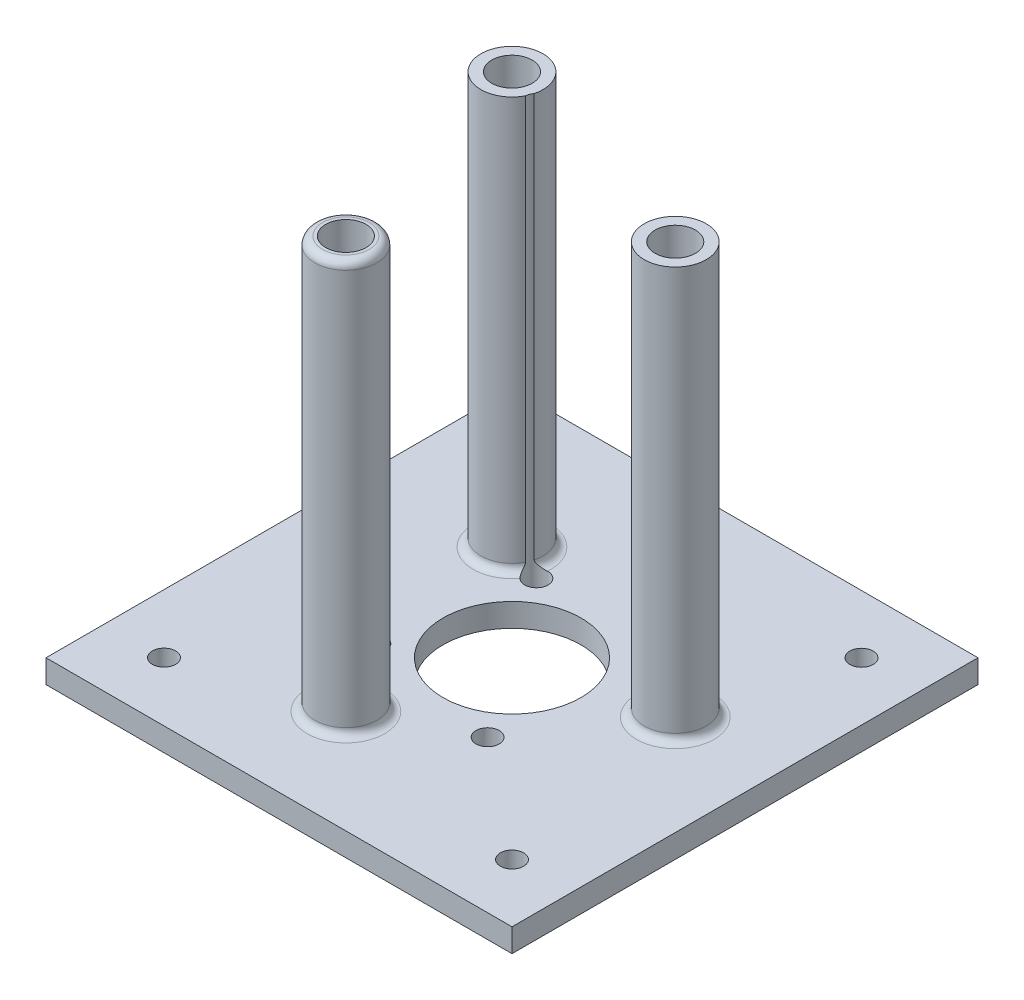
ISO-10303-21;
HEADER;
FILE_DESCRIPTION(('STEP AP214'),'2;1');
FILE_NAME('part.step','',(''),(''),'','','');
FILE_SCHEMA(('AUTOMOTIVE_DESIGN { 1 0 10303 214 1 1 1 1 }'));
ENDSEC;
DATA;
#1=APPLICATION_CONTEXT('core data for automotive mechanical design processes');
#2=APPLICATION_PROTOCOL_DEFINITION('international standard','automotive_design',2000,#1);
#3=PRODUCT_CONTEXT('',#1,'mechanical');
#4=PRODUCT('Part','Part','',(#3));
#5=PRODUCT_RELATED_PRODUCT_CATEGORY('part','',(#4));
#6=PRODUCT_DEFINITION_FORMATION('','',#4);
#7=PRODUCT_DEFINITION_CONTEXT('part definition',#1,'design');
#8=PRODUCT_DEFINITION('design','',#6,#7);
#9=PRODUCT_DEFINITION_SHAPE('','',#8);
#10=(LENGTH_UNIT() NAMED_UNIT(*) SI_UNIT(.MILLI.,.METRE.));
#11=(NAMED_UNIT(*) PLANE_ANGLE_UNIT() SI_UNIT($,.RADIAN.));
#12=(NAMED_UNIT(*) SI_UNIT($,.STERADIAN.) SOLID_ANGLE_UNIT());
#13=UNCERTAINTY_MEASURE_WITH_UNIT(LENGTH_MEASURE(1.E-05),#10,'distance_accuracy_value','');
#14=(GEOMETRIC_REPRESENTATION_CONTEXT(3) GLOBAL_UNCERTAINTY_ASSIGNED_CONTEXT((#13)) GLOBAL_UNIT_ASSIGNED_CONTEXT((#10,
#11,#12)) REPRESENTATION_CONTEXT('',''));
#15=CARTESIAN_POINT('',(0.,0.,0.));
#16=DIRECTION('',(0.,0.,1.));
#17=DIRECTION('',(1.,0.,0.));
#18=AXIS2_PLACEMENT_3D('',#15,#16,#17);
#19=CARTESIAN_POINT('',(29.9166320617212,3.,0.));
#20=DIRECTION('',(1.,0.,0.));
#21=DIRECTION('',(0.,0.,-1.));
#22=AXIS2_PLACEMENT_3D('',#19,#20,#21);
#23=PLANE('',#22);
#24=DIRECTION('',(0.,0.,1.));
#25=VECTOR('',#24,1.);
#26=CARTESIAN_POINT('',(29.9166320617212,0.,0.));
#27=LINE('',#26,#25);
#28=CARTESIAN_POINT('',(29.9166320617212,0.,-29.8888427489616));
#29=VERTEX_POINT('',#28);
#30=CARTESIAN_POINT('',(29.9166320617212,0.,30.1111572510384));
#31=VERTEX_POINT('',#30);
#32=EDGE_CURVE('E202',#29,#31,#27,.T.);
#33=ORIENTED_EDGE('',*,*,#32,.F.);
#34=DIRECTION('',(0.,-1.,0.));
#35=VECTOR('',#34,1.);
#36=CARTESIAN_POINT('',(29.9166320617212,3.,-29.8888427489616));
#37=LINE('',#36,#35);
#38=CARTESIAN_POINT('',(29.9166320617212,3.,-29.8888427489616));
#39=VERTEX_POINT('',#38);
#40=EDGE_CURVE('E226',#39,#29,#37,.T.);
#41=ORIENTED_EDGE('',*,*,#40,.F.);
#42=DIRECTION('',(0.,0.,1.));
#43=VECTOR('',#42,1.);
#44=CARTESIAN_POINT('',(29.9166320617212,3.,0.));
#45=LINE('',#44,#43);
#46=CARTESIAN_POINT('',(29.9166320617212,3.,30.1111572510384));
#47=VERTEX_POINT('',#46);
#48=EDGE_CURVE('E165',#39,#47,#45,.T.);
#49=ORIENTED_EDGE('',*,*,#48,.T.);
#50=DIRECTION('',(0.,-1.,0.));
#51=VECTOR('',#50,1.);
#52=CARTESIAN_POINT('',(29.9166320617212,3.,30.1111572510384));
#53=LINE('',#52,#51);
#54=EDGE_CURVE('E180',#47,#31,#53,.T.);
#55=ORIENTED_EDGE('',*,*,#54,.T.);
#56=EDGE_LOOP('',(#33,#41,#49,#55));
#57=FACE_BOUND('',#56,.T.);
#58=ADVANCED_FACE('F41',(#57),#23,.T.);
#59=CARTESIAN_POINT('',(0.,3.,-29.8888427489616));
#60=DIRECTION('',(0.,0.,-1.));
#61=DIRECTION('',(-1.,0.,0.));
#62=AXIS2_PLACEMENT_3D('',#59,#60,#61);
#63=PLANE('',#62);
#64=DIRECTION('',(1.,0.,0.));
#65=VECTOR('',#64,1.);
#66=CARTESIAN_POINT('',(0.,0.,-29.8888427489616));
#67=LINE('',#66,#65);
#68=CARTESIAN_POINT('',(-30.0833679382788,0.,-29.8888427489616));
#69=VERTEX_POINT('',#68);
#70=EDGE_CURVE('E206',#69,#29,#67,.T.);
#71=ORIENTED_EDGE('',*,*,#70,.F.);
#72=DIRECTION('',(0.,-1.,0.));
#73=VECTOR('',#72,1.);
#74=CARTESIAN_POINT('',(-30.0833679382788,3.,-29.8888427489616));
#75=LINE('',#74,#73);
#76=CARTESIAN_POINT('',(-30.0833679382788,3.,-29.8888427489616));
#77=VERTEX_POINT('',#76);
#78=EDGE_CURVE('E223',#77,#69,#75,.T.);
#79=ORIENTED_EDGE('',*,*,#78,.F.);
#80=DIRECTION('',(1.,0.,0.));
#81=VECTOR('',#80,1.);
#82=CARTESIAN_POINT('',(0.,3.,-29.8888427489616));
#83=LINE('',#82,#81);
#84=EDGE_CURVE('E169',#77,#39,#83,.T.);
#85=ORIENTED_EDGE('',*,*,#84,.T.);
#86=ORIENTED_EDGE('',*,*,#40,.T.);
#87=EDGE_LOOP('',(#71,#79,#85,#86));
#88=FACE_BOUND('',#87,.T.);
#89=ADVANCED_FACE('F303',(#88),#63,.T.);
#90=CARTESIAN_POINT('',(-30.0833679382788,3.,0.));
#91=DIRECTION('',(1.,0.,0.));
#92=DIRECTION('',(0.,0.,-1.));
#93=AXIS2_PLACEMENT_3D('',#90,#91,#92);
#94=PLANE('',#93);
#95=DIRECTION('',(0.,0.,1.));
#96=VECTOR('',#95,1.);
#97=CARTESIAN_POINT('',(-30.0833679382788,0.,0.));
#98=LINE('',#97,#96);
#99=CARTESIAN_POINT('',(-30.0833679382788,0.,30.1111572510384));
#100=VERTEX_POINT('',#99);
#101=EDGE_CURVE('E210',#69,#100,#98,.T.);
#102=ORIENTED_EDGE('',*,*,#101,.T.);
#103=DIRECTION('',(0.,-1.,0.));
#104=VECTOR('',#103,1.);
#105=CARTESIAN_POINT('',(-30.0833679382788,3.,30.1111572510384));
#106=LINE('',#105,#104);
#107=CARTESIAN_POINT('',(-30.0833679382788,3.,30.1111572510384));
#108=VERTEX_POINT('',#107);
#109=EDGE_CURVE('E219',#108,#100,#106,.T.);
#110=ORIENTED_EDGE('',*,*,#109,.F.);
#111=DIRECTION('',(0.,0.,1.));
#112=VECTOR('',#111,1.);
#113=CARTESIAN_POINT('',(-30.0833679382788,3.,0.));
#114=LINE('',#113,#112);
#115=EDGE_CURVE('E173',#77,#108,#114,.T.);
#116=ORIENTED_EDGE('',*,*,#115,.F.);
#117=ORIENTED_EDGE('',*,*,#78,.T.);
#118=EDGE_LOOP('',(#102,#110,#116,#117));
#119=FACE_BOUND('',#118,.T.);
#120=ADVANCED_FACE('F278',(#119),#94,.F.);
#121=CARTESIAN_POINT('',(-7.37576634527576,3.,-10.3205696181635));
#122=DIRECTION('',(0.,-1.,0.));
#123=DIRECTION('',(0.,0.,-1.));
#124=AXIS2_PLACEMENT_3D('',#121,#122,#123);
#125=CYLINDRICAL_SURFACE('',#124,1.5);
#126=DIRECTION('',(0.,-1.,0.));
#127=VECTOR('',#126,1.);
#128=CARTESIAN_POINT('',(-8.87187084224171,56.,-10.428603567264));
#129=LINE('',#128,#127);
#130=CARTESIAN_POINT('',(-8.87187084224171,56.,-10.428603567264));
#131=VERTEX_POINT('',#130);
#132=CARTESIAN_POINT('',(-8.87187084224171,4.,-10.428603567264));
#133=VERTEX_POINT('',#132);
#134=EDGE_CURVE('E108',#131,#133,#129,.T.);
#135=ORIENTED_EDGE('',*,*,#134,.T.);
#136=CARTESIAN_POINT('',(-8.87187084224171,4.,-10.428603567264));
#137=CARTESIAN_POINT('',(-8.87184067217819,3.97176934304285,-10.4287382705425));
#138=CARTESIAN_POINT('',(-8.87209722711787,3.94381525377746,-10.4255187396239));
#139=CARTESIAN_POINT('',(-8.87287371271332,3.88955773884842,-10.4139305742851));
#140=CARTESIAN_POINT('',(-8.8733881224425,3.86323219674153,-10.405669117642));
#141=CARTESIAN_POINT('',(-8.87466015286941,3.79857566096496,-10.380080502114));
#142=CARTESIAN_POINT('',(-8.87540208961787,3.76128125837833,-10.3602690749949));
#143=CARTESIAN_POINT('',(-8.87592922737615,3.68935514958082,-10.3156335737701));
#144=CARTESIAN_POINT('',(-8.87570218561712,3.65476317331085,-10.2907491612967));
#145=CARTESIAN_POINT('',(-8.87372346696246,3.58804262537501,-10.2379721592256));
#146=CARTESIAN_POINT('',(-8.87197228573329,3.55591325653861,-10.2100805501838));
#147=CARTESIAN_POINT('',(-8.8665726311351,3.49375395098718,-10.1522075305655));
#148=CARTESIAN_POINT('',(-8.86292254857545,3.46372581945303,-10.1222243662272));
#149=CARTESIAN_POINT('',(-8.84868848564273,3.37683099733819,-10.0301610933151));
#150=CARTESIAN_POINT('',(-8.83481780225356,3.32286958462097,-9.96572904034051));
#151=CARTESIAN_POINT('',(-8.80032181998036,3.23496321259527,-9.84774452288231));
#152=CARTESIAN_POINT('',(-8.7818384569456,3.19922196855153,-9.79489617313397));
#153=CARTESIAN_POINT('',(-8.73713196504163,3.13483560173249,-9.68810297655839));
#154=CARTESIAN_POINT('',(-8.71091950728153,3.10618079476582,-9.63415973637244));
#155=CARTESIAN_POINT('',(-8.65660330703867,3.06311211694501,-9.53838619432496));
#156=CARTESIAN_POINT('',(-8.63010028084505,3.04696363514807,-9.49643039153087));
#157=CARTESIAN_POINT('',(-8.57194796754169,3.02137981090074,-9.41410964658085));
#158=CARTESIAN_POINT('',(-8.54031159640014,3.01192793145482,-9.37374101969361));
#159=CARTESIAN_POINT('',(-8.49403031145033,3.00419054922414,-9.32064712519376));
#160=CARTESIAN_POINT('',(-8.48133729871753,3.00262508948983,-9.30663058293478));
#161=CARTESIAN_POINT('',(-8.45539310537056,3.00053013999067,-9.27904983521629));
#162=CARTESIAN_POINT('',(-8.44214204719819,3.00000042416862,-9.26548553168842));
#163=CARTESIAN_POINT('',(-8.42863134705702,2.99999999999998,-9.25217114941493));
#164=B_SPLINE_CURVE_WITH_KNOTS('',3,(#136,#137,#138,#139,#140,#141,#142,#143,#144,#145,#146,
#147,#148,#149,#150,#151,#152,#153,#154,#155,#156,#157,#158,#159,#160,#161,#162,#163),
.UNSPECIFIED.,.F.,.F.,(4,2,2,2,2,2,2,2,2,2,2,2,2,4),(0.,0.0840740136254723,0.166420241253782,
0.292433966498774,0.420044521351919,0.547613591388197,0.6752909441201,0.9295443319198,
1.12816730349108,1.32651732180563,1.48248772239801,1.63807160492424,1.69496112892353,
1.75183823506335),.UNSPECIFIED.);
#165=CARTESIAN_POINT('',(-8.42863134705701,3.,-9.25217114941494));
#166=VERTEX_POINT('',#165);
#167=EDGE_CURVE('E63',#133,#166,#164,.T.);
#168=ORIENTED_EDGE('',*,*,#167,.T.);
#169=CARTESIAN_POINT('',(-7.37576634527576,3.,-10.3205696181635));
#170=DIRECTION('',(0.,1.,0.));
#171=DIRECTION('',(0.,0.,1.));
#172=AXIS2_PLACEMENT_3D('',#169,#170,#171);
#173=CIRCLE('',#172,1.5);
#174=CARTESIAN_POINT('',(-7.45689944827082,3.,-11.8183738175161));
#175=VERTEX_POINT('',#174);
#176=EDGE_CURVE('E162',#166,#175,#173,.T.);
#177=ORIENTED_EDGE('',*,*,#176,.T.);
#178=CARTESIAN_POINT('',(-7.45689944827082,3.,-11.8183738175161));
#179=CARTESIAN_POINT('',(-7.48384267313955,2.9999968455293,-11.816918278987));
#180=CARTESIAN_POINT('',(-7.51072680475569,3.00107197957294,-11.814728381199));
#181=CARTESIAN_POINT('',(-7.56415173228456,3.00528844687066,-11.8089345295639));
#182=CARTESIAN_POINT('',(-7.5906928541858,3.0084276445182,-11.8053320388253));
#183=CARTESIAN_POINT('',(-7.66902150536573,3.02072680534029,-11.7925664832664));
#184=CARTESIAN_POINT('',(-7.72006144681991,3.03277223836893,-11.7814138304384));
#185=CARTESIAN_POINT('',(-7.81855619813955,3.06346124666043,-11.7546342539507));
#186=CARTESIAN_POINT('',(-7.8660240353592,3.08207928006594,-11.7390246946));
#187=CARTESIAN_POINT('',(-7.95710293061214,3.12483150161788,-11.7042005060119));
#188=CARTESIAN_POINT('',(-8.00070270641135,3.14898113482462,-11.6849758101974));
#189=CARTESIAN_POINT('',(-8.10515293332082,3.21542771403153,-11.6331727053424));
#190=CARTESIAN_POINT('',(-8.16328033516901,3.26065485148852,-11.5988261432032));
#191=CARTESIAN_POINT('',(-8.24313890544823,3.33438051607456,-11.5447857322293));
#192=CARTESIAN_POINT('',(-8.26856374758056,3.35997255613191,-11.5263272999429));
#193=CARTESIAN_POINT('',(-8.31699369213383,3.41301396839425,-11.4889124445025));
#194=CARTESIAN_POINT('',(-8.33999973556556,3.44046261142456,-11.4699562186244));
#195=CARTESIAN_POINT('',(-8.39166093874478,3.50773970793561,-11.4248929642958));
#196=CARTESIAN_POINT('',(-8.41923365751764,3.54837482681568,-11.3987492235463));
#197=CARTESIAN_POINT('',(-8.46931533555652,3.63355154984613,-11.3478974050148));
#198=CARTESIAN_POINT('',(-8.49183102298434,3.67808785259133,-11.3231874525136));
#199=CARTESIAN_POINT('',(-8.52123096416486,3.75057766952534,-11.2891586643268));
#200=CARTESIAN_POINT('',(-8.53052722660629,3.77666805508895,-11.2780088936601));
#201=CARTESIAN_POINT('',(-8.54650642894278,3.83048901245797,-11.2583995292904));
#202=CARTESIAN_POINT('',(-8.55320575983573,3.85820798158835,-11.2499231276507));
#203=CARTESIAN_POINT('',(-8.56140113037024,3.90502214894231,-11.2394276007067));
#204=CARTESIAN_POINT('',(-8.5639011325788,3.92365762535766,-11.2361833340086));
#205=CARTESIAN_POINT('',(-8.56731441218648,3.96150748278233,-11.2317315916445));
#206=CARTESIAN_POINT('',(-8.56821056702264,3.98072590880373,-11.2305460992271));
#207=CARTESIAN_POINT('',(-8.56818752840913,4.,-11.230587047675));
#208=B_SPLINE_CURVE_WITH_KNOTS('',3,(#178,#179,#180,#181,#182,#183,#184,#185,#186,#187,#188,
#189,#190,#191,#192,#193,#194,#195,#196,#197,#198,#199,#200,#201,#202,#203,#204,#205,#206,#207),
.UNSPECIFIED.,.F.,.F.,(4,2,2,2,2,2,2,2,2,2,2,2,2,2,4),(0.,0.0808815755149433,0.161679597410632,
0.32165658316092,0.481018602763171,0.640831129513227,0.883197250791613,1.00468702296784,
1.12612935442732,1.29275081635536,1.45914926485655,1.54854738033475,1.63737168086891,
1.69444079881121,1.75211562829355),.UNSPECIFIED.);
#209=CARTESIAN_POINT('',(-8.56818752840913,4.,-11.230587047675));
#210=VERTEX_POINT('',#209);
#211=EDGE_CURVE('E121',#175,#210,#208,.T.);
#212=ORIENTED_EDGE('',*,*,#211,.T.);
#213=DIRECTION('',(0.,-1.,0.));
#214=VECTOR('',#213,1.);
#215=CARTESIAN_POINT('',(-8.56818752840913,56.,-11.230587047675));
#216=LINE('',#215,#214);
#217=CARTESIAN_POINT('',(-8.56818752840913,56.,-11.230587047675));
#218=VERTEX_POINT('',#217);
#219=EDGE_CURVE('E106',#218,#210,#216,.T.);
#220=ORIENTED_EDGE('',*,*,#219,.F.);
#221=CARTESIAN_POINT('',(-7.37576634527576,56.,-10.3205696181635));
#222=DIRECTION('',(0.,1.,0.));
#223=DIRECTION('',(0.,0.,1.));
#224=AXIS2_PLACEMENT_3D('',#221,#222,#223);
#225=CIRCLE('',#224,1.5);
#226=EDGE_CURVE('E112',#131,#218,#225,.F.);
#227=ORIENTED_EDGE('',*,*,#226,.F.);
#228=EDGE_LOOP('',(#135,#168,#177,#212,#220,#227));
#229=FACE_BOUND('',#228,.T.);
#230=CARTESIAN_POINT('',(-7.37576634527576,0.,-10.3205696181635));
#231=DIRECTION('',(0.,1.,0.));
#232=DIRECTION('',(0.,0.,1.));
#233=AXIS2_PLACEMENT_3D('',#230,#231,#232);
#234=CIRCLE('',#233,1.5);
#235=CARTESIAN_POINT('',(-7.37576634527576,0.,-8.82056961816346));
#236=VERTEX_POINT('',#235);
#237=EDGE_CURVE('E198',#236,#236,#234,.T.);
#238=ORIENTED_EDGE('',*,*,#237,.F.);
#239=EDGE_LOOP('',(#238));
#240=FACE_BOUND('',#239,.T.);
#241=ADVANCED_FACE('F118',(#229,#240),#125,.F.);
#242=CARTESIAN_POINT('',(-10.5150948074807,3.,7.40355565803537));
#243=DIRECTION('',(0.,-1.,0.));
#244=DIRECTION('',(0.,0.,-1.));
#245=AXIS2_PLACEMENT_3D('',#242,#243,#244);
#246=CYLINDRICAL_SURFACE('',#245,1.5);
#247=CARTESIAN_POINT('',(-10.5150948074807,3.,7.40355565803537));
#248=DIRECTION('',(0.,1.,0.));
#249=DIRECTION('',(0.,0.,1.));
#250=AXIS2_PLACEMENT_3D('',#247,#248,#249);
#251=CIRCLE('',#250,1.5);
#252=CARTESIAN_POINT('',(-10.5150948074807,3.,8.90355565803537));
#253=VERTEX_POINT('',#252);
#254=EDGE_CURVE('E158',#253,#253,#251,.T.);
#255=ORIENTED_EDGE('',*,*,#254,.T.);
#256=EDGE_LOOP('',(#255));
#257=FACE_BOUND('',#256,.T.);
#258=CARTESIAN_POINT('',(-10.5150948074807,0.,7.40355565803537));
#259=DIRECTION('',(0.,1.,0.));
#260=DIRECTION('',(0.,0.,1.));
#261=AXIS2_PLACEMENT_3D('',#258,#259,#260);
#262=CIRCLE('',#261,1.5);
#263=CARTESIAN_POINT('',(-10.5150948074807,0.,8.90355565803537));
#264=VERTEX_POINT('',#263);
#265=EDGE_CURVE('E194',#264,#264,#262,.T.);
#266=ORIENTED_EDGE('',*,*,#265,.F.);
#267=EDGE_LOOP('',(#266));
#268=FACE_BOUND('',#267,.T.);
#269=ADVANCED_FACE('F277',(#257,#268),#246,.F.);
#270=CARTESIAN_POINT('',(-0.083367938278827,3.,0.111157251038434));
#271=DIRECTION('',(0.,-1.,0.));
#272=DIRECTION('',(0.,0.,-1.));
#273=AXIS2_PLACEMENT_3D('',#270,#271,#272);
#274=CYLINDRICAL_SURFACE('',#273,8.88410834181085);
#275=CARTESIAN_POINT('',(-0.083367938278827,3.,0.111157251038434));
#276=DIRECTION('',(0.,1.,0.));
#277=DIRECTION('',(0.,0.,1.));
#278=AXIS2_PLACEMENT_3D('',#275,#276,#277);
#279=CIRCLE('',#278,8.88410834181085);
#280=CARTESIAN_POINT('',(-0.083367938278827,3.,8.99526559284929));
#281=VERTEX_POINT('',#280);
#282=EDGE_CURVE('E154',#281,#281,#279,.T.);
#283=ORIENTED_EDGE('',*,*,#282,.T.);
#284=EDGE_LOOP('',(#283));
#285=FACE_BOUND('',#284,.T.);
#286=CARTESIAN_POINT('',(-0.083367938278827,0.,0.111157251038434));
#287=DIRECTION('',(0.,1.,0.));
#288=DIRECTION('',(0.,0.,1.));
#289=AXIS2_PLACEMENT_3D('',#286,#287,#288);
#290=CIRCLE('',#289,8.88410834181085);
#291=CARTESIAN_POINT('',(-0.083367938278827,0.,8.99526559284929));
#292=VERTEX_POINT('',#291);
#293=EDGE_CURVE('E190',#292,#292,#290,.T.);
#294=ORIENTED_EDGE('',*,*,#293,.F.);
#295=EDGE_LOOP('',(#294));
#296=FACE_BOUND('',#295,.T.);
#297=ADVANCED_FACE('F283',(#285,#296),#274,.F.);
#298=CARTESIAN_POINT('',(7.20903046871812,3.,10.5428841202403));
#299=DIRECTION('',(0.,-1.,0.));
#300=DIRECTION('',(0.,0.,-1.));
#301=AXIS2_PLACEMENT_3D('',#298,#299,#300);
#302=CYLINDRICAL_SURFACE('',#301,1.5);
#303=CARTESIAN_POINT('',(7.20903046871812,3.,10.5428841202403));
#304=DIRECTION('',(0.,1.,0.));
#305=DIRECTION('',(0.,0.,1.));
#306=AXIS2_PLACEMENT_3D('',#303,#304,#305);
#307=CIRCLE('',#306,1.5);
#308=CARTESIAN_POINT('',(7.20903046871812,3.,12.0428841202403));
#309=VERTEX_POINT('',#308);
#310=EDGE_CURVE('E149',#309,#309,#307,.T.);
#311=ORIENTED_EDGE('',*,*,#310,.T.);
#312=EDGE_LOOP('',(#311));
#313=FACE_BOUND('',#312,.T.);
#314=CARTESIAN_POINT('',(7.20903046871812,0.,10.5428841202403));
#315=DIRECTION('',(0.,1.,0.));
#316=DIRECTION('',(0.,0.,1.));
#317=AXIS2_PLACEMENT_3D('',#314,#315,#316);
#318=CIRCLE('',#317,1.5);
#319=CARTESIAN_POINT('',(7.20903046871812,0.,12.0428841202403));
#320=VERTEX_POINT('',#319);
#321=EDGE_CURVE('E185',#320,#320,#318,.T.);
#322=ORIENTED_EDGE('',*,*,#321,.F.);
#323=EDGE_LOOP('',(#322));
#324=FACE_BOUND('',#323,.T.);
#325=ADVANCED_FACE('F287',(#313,#324),#302,.F.);
#326=CARTESIAN_POINT('',(10.3483589309231,3.,-7.18124115595851));
#327=DIRECTION('',(0.,-1.,0.));
#328=DIRECTION('',(0.,0.,-1.));
#329=AXIS2_PLACEMENT_3D('',#326,#327,#328);
#330=CYLINDRICAL_SURFACE('',#329,1.5);
#331=CARTESIAN_POINT('',(10.3483589309231,3.,-7.18124115595851));
#332=DIRECTION('',(0.,1.,0.));
#333=DIRECTION('',(0.,0.,1.));
#334=AXIS2_PLACEMENT_3D('',#331,#332,#333);
#335=CIRCLE('',#334,1.5);
#336=CARTESIAN_POINT('',(10.3483589309231,3.,-5.68124115595851));
#337=VERTEX_POINT('',#336);
#338=EDGE_CURVE('E145',#337,#337,#335,.T.);
#339=ORIENTED_EDGE('',*,*,#338,.T.);
#340=EDGE_LOOP('',(#339));
#341=FACE_BOUND('',#340,.T.);
#342=CARTESIAN_POINT('',(10.3483589309231,0.,-7.18124115595851));
#343=DIRECTION('',(0.,1.,0.));
#344=DIRECTION('',(0.,0.,1.));
#345=AXIS2_PLACEMENT_3D('',#342,#343,#344);
#346=CIRCLE('',#345,1.5);
#347=CARTESIAN_POINT('',(10.3483589309231,0.,-5.68124115595851));
#348=VERTEX_POINT('',#347);
#349=EDGE_CURVE('E181',#348,#348,#346,.T.);
#350=ORIENTED_EDGE('',*,*,#349,.F.);
#351=EDGE_LOOP('',(#350));
#352=FACE_BOUND('',#351,.T.);
#353=ADVANCED_FACE('F290',(#341,#352),#330,.F.);
#354=CARTESIAN_POINT('',(0.,3.,30.1111572510384));
#355=DIRECTION('',(0.,0.,-1.));
#356=DIRECTION('',(-1.,0.,0.));
#357=AXIS2_PLACEMENT_3D('',#354,#355,#356);
#358=PLANE('',#357);
#359=DIRECTION('',(1.,0.,0.));
#360=VECTOR('',#359,1.);
#361=CARTESIAN_POINT('',(0.,0.,30.1111572510384));
#362=LINE('',#361,#360);
#363=EDGE_CURVE('E150',#100,#31,#362,.T.);
#364=ORIENTED_EDGE('',*,*,#363,.T.);
#365=ORIENTED_EDGE('',*,*,#54,.F.);
#366=DIRECTION('',(1.,0.,0.));
#367=VECTOR('',#366,1.);
#368=CARTESIAN_POINT('',(0.,3.,30.1111572510384));
#369=LINE('',#368,#367);
#370=EDGE_CURVE('E177',#108,#47,#369,.T.);
#371=ORIENTED_EDGE('',*,*,#370,.F.);
#372=ORIENTED_EDGE('',*,*,#109,.T.);
#373=EDGE_LOOP('',(#364,#365,#371,#372));
#374=FACE_BOUND('',#373,.T.);
#375=ADVANCED_FACE('F293',(#374),#358,.F.);
#376=CARTESIAN_POINT('',(0.,3.,0.));
#377=DIRECTION('',(0.,1.,0.));
#378=DIRECTION('',(0.,0.,1.));
#379=AXIS2_PLACEMENT_3D('',#376,#377,#378);
#380=PLANE('',#379);
#381=CARTESIAN_POINT('',(-4.80677738298205,3.,16.7749036119571));
#382=DIRECTION('',(0.,1.,0.));
#383=DIRECTION('',(0.,0.,1.));
#384=AXIS2_PLACEMENT_3D('',#381,#382,#383);
#385=CIRCLE('',#384,5.);
#386=CARTESIAN_POINT('',(-4.80677738298205,3.,21.7749036119571));
#387=VERTEX_POINT('',#386);
#388=EDGE_CURVE('E475',#387,#387,#385,.F.);
#389=ORIENTED_EDGE('',*,*,#388,.T.);
#390=EDGE_LOOP('',(#389));
#391=FACE_BOUND('',#390,.T.);
#392=CARTESIAN_POINT('',(17.0328170930816,3.,-3.79284087111856));
#393=DIRECTION('',(0.,1.,0.));
#394=DIRECTION('',(0.,0.,1.));
#395=AXIS2_PLACEMENT_3D('',#392,#393,#394);
#396=CIRCLE('',#395,5.);
#397=CARTESIAN_POINT('',(17.0328170930816,3.,1.20715912888144));
#398=VERTEX_POINT('',#397);
#399=EDGE_CURVE('E471',#398,#398,#396,.F.);
#400=ORIENTED_EDGE('',*,*,#399,.T.);
#401=EDGE_LOOP('',(#400));
#402=FACE_BOUND('',#401,.T.);
#403=ORIENTED_EDGE('',*,*,#176,.F.);
#404=CARTESIAN_POINT('',(-12.4392647098964,3.,-12.2379407367877));
#405=DIRECTION('',(0.,1.,0.));
#406=DIRECTION('',(0.,0.,1.));
#407=AXIS2_PLACEMENT_3D('',#404,#405,#406);
#408=CIRCLE('',#407,5.);
#409=EDGE_CURVE('E56',#166,#175,#408,.F.);
#410=ORIENTED_EDGE('',*,*,#409,.T.);
#411=EDGE_LOOP('',(#403,#410));
#412=FACE_BOUND('',#411,.T.);
#413=CARTESIAN_POINT('',(-22.5,3.,22.5));
#414=DIRECTION('',(0.,1.,0.));
#415=DIRECTION('',(0.,0.,1.));
#416=AXIS2_PLACEMENT_3D('',#413,#414,#415);
#417=CIRCLE('',#416,1.5);
#418=CARTESIAN_POINT('',(-22.5,3.,24.));
#419=VERTEX_POINT('',#418);
#420=EDGE_CURVE('E123',#419,#419,#417,.T.);
#421=ORIENTED_EDGE('',*,*,#420,.F.);
#422=EDGE_LOOP('',(#421));
#423=FACE_BOUND('',#422,.T.);
#424=CARTESIAN_POINT('',(22.4166320617212,3.,22.6111572510384));
#425=DIRECTION('',(0.,1.,0.));
#426=DIRECTION('',(0.,0.,1.));
#427=AXIS2_PLACEMENT_3D('',#424,#425,#426);
#428=CIRCLE('',#427,1.5);
#429=CARTESIAN_POINT('',(22.4166320617212,3.,24.1111572510384));
#430=VERTEX_POINT('',#429);
#431=EDGE_CURVE('E128',#430,#430,#428,.T.);
#432=ORIENTED_EDGE('',*,*,#431,.F.);
#433=EDGE_LOOP('',(#432));
#434=FACE_BOUND('',#433,.T.);
#435=CARTESIAN_POINT('',(22.4166320617212,3.,-22.3888427489616));
#436=DIRECTION('',(0.,1.,0.));
#437=DIRECTION('',(0.,0.,1.));
#438=AXIS2_PLACEMENT_3D('',#435,#436,#437);
#439=CIRCLE('',#438,1.5);
#440=CARTESIAN_POINT('',(22.4166320617212,3.,-20.8888427489616));
#441=VERTEX_POINT('',#440);
#442=EDGE_CURVE('E133',#441,#441,#439,.T.);
#443=ORIENTED_EDGE('',*,*,#442,.F.);
#444=EDGE_LOOP('',(#443));
#445=FACE_BOUND('',#444,.T.);
#446=CARTESIAN_POINT('',(-22.5833679382788,3.,-22.3888427489616));
#447=DIRECTION('',(0.,1.,0.));
#448=DIRECTION('',(0.,0.,1.));
#449=AXIS2_PLACEMENT_3D('',#446,#447,#448);
#450=CIRCLE('',#449,1.5);
#451=CARTESIAN_POINT('',(-22.5833679382788,3.,-20.8888427489616));
#452=VERTEX_POINT('',#451);
#453=EDGE_CURVE('E137',#452,#452,#450,.T.);
#454=ORIENTED_EDGE('',*,*,#453,.F.);
#455=EDGE_LOOP('',(#454));
#456=FACE_BOUND('',#455,.T.);
#457=ORIENTED_EDGE('',*,*,#338,.F.);
#458=EDGE_LOOP('',(#457));
#459=FACE_BOUND('',#458,.T.);
#460=ORIENTED_EDGE('',*,*,#310,.F.);
#461=EDGE_LOOP('',(#460));
#462=FACE_BOUND('',#461,.T.);
#463=ORIENTED_EDGE('',*,*,#282,.F.);
#464=EDGE_LOOP('',(#463));
#465=FACE_BOUND('',#464,.T.);
#466=ORIENTED_EDGE('',*,*,#254,.F.);
#467=EDGE_LOOP('',(#466));
#468=FACE_BOUND('',#467,.T.);
#469=ORIENTED_EDGE('',*,*,#48,.F.);
#470=ORIENTED_EDGE('',*,*,#84,.F.);
#471=ORIENTED_EDGE('',*,*,#115,.T.);
#472=ORIENTED_EDGE('',*,*,#370,.T.);
#473=EDGE_LOOP('',(#469,#470,#471,#472));
#474=FACE_BOUND('',#473,.T.);
#475=ADVANCED_FACE('F298',(#391,#402,#412,#423,#434,#445,#456,#459,#462,#465,#468,#474),#380,.T.);
#476=CARTESIAN_POINT('',(0.,0.,0.));
#477=DIRECTION('',(0.,1.,0.));
#478=DIRECTION('',(0.,0.,1.));
#479=AXIS2_PLACEMENT_3D('',#476,#477,#478);
#480=PLANE('',#479);
#481=CARTESIAN_POINT('',(-22.5,0.,22.5));
#482=DIRECTION('',(0.,1.,0.));
#483=DIRECTION('',(0.,0.,1.));
#484=AXIS2_PLACEMENT_3D('',#481,#482,#483);
#485=CIRCLE('',#484,1.5);
#486=CARTESIAN_POINT('',(-22.5,0.,24.));
#487=VERTEX_POINT('',#486);
#488=EDGE_CURVE('E186',#487,#487,#485,.T.);
#489=ORIENTED_EDGE('',*,*,#488,.T.);
#490=EDGE_LOOP('',(#489));
#491=FACE_BOUND('',#490,.T.);
#492=CARTESIAN_POINT('',(22.4166320617212,0.,22.6111572510384));
#493=DIRECTION('',(0.,1.,0.));
#494=DIRECTION('',(0.,0.,1.));
#495=AXIS2_PLACEMENT_3D('',#492,#493,#494);
#496=CIRCLE('',#495,1.5);
#497=CARTESIAN_POINT('',(22.4166320617212,0.,24.1111572510384));
#498=VERTEX_POINT('',#497);
#499=EDGE_CURVE('E237',#498,#498,#496,.T.);
#500=ORIENTED_EDGE('',*,*,#499,.T.);
#501=EDGE_LOOP('',(#500));
#502=FACE_BOUND('',#501,.T.);
#503=CARTESIAN_POINT('',(22.4166320617212,0.,-22.3888427489616));
#504=DIRECTION('',(0.,1.,0.));
#505=DIRECTION('',(0.,0.,1.));
#506=AXIS2_PLACEMENT_3D('',#503,#504,#505);
#507=CIRCLE('',#506,1.5);
#508=CARTESIAN_POINT('',(22.4166320617212,0.,-20.8888427489616));
#509=VERTEX_POINT('',#508);
#510=EDGE_CURVE('E233',#509,#509,#507,.T.);
#511=ORIENTED_EDGE('',*,*,#510,.T.);
#512=EDGE_LOOP('',(#511));
#513=FACE_BOUND('',#512,.T.);
#514=CARTESIAN_POINT('',(-22.5833679382788,0.,-22.3888427489616));
#515=DIRECTION('',(0.,1.,0.));
#516=DIRECTION('',(0.,0.,1.));
#517=AXIS2_PLACEMENT_3D('',#514,#515,#516);
#518=CIRCLE('',#517,1.5);
#519=CARTESIAN_POINT('',(-22.5833679382788,0.,-20.8888427489616));
#520=VERTEX_POINT('',#519);
#521=EDGE_CURVE('E144',#520,#520,#518,.T.);
#522=ORIENTED_EDGE('',*,*,#521,.T.);
#523=EDGE_LOOP('',(#522));
#524=FACE_BOUND('',#523,.T.);
#525=ORIENTED_EDGE('',*,*,#349,.T.);
#526=EDGE_LOOP('',(#525));
#527=FACE_BOUND('',#526,.T.);
#528=ORIENTED_EDGE('',*,*,#321,.T.);
#529=EDGE_LOOP('',(#528));
#530=FACE_BOUND('',#529,.T.);
#531=ORIENTED_EDGE('',*,*,#293,.T.);
#532=EDGE_LOOP('',(#531));
#533=FACE_BOUND('',#532,.T.);
#534=ORIENTED_EDGE('',*,*,#265,.T.);
#535=EDGE_LOOP('',(#534));
#536=FACE_BOUND('',#535,.T.);
#537=ORIENTED_EDGE('',*,*,#237,.T.);
#538=EDGE_LOOP('',(#537));
#539=FACE_BOUND('',#538,.T.);
#540=ORIENTED_EDGE('',*,*,#32,.T.);
#541=ORIENTED_EDGE('',*,*,#363,.F.);
#542=ORIENTED_EDGE('',*,*,#101,.F.);
#543=ORIENTED_EDGE('',*,*,#70,.T.);
#544=EDGE_LOOP('',(#540,#541,#542,#543));
#545=FACE_BOUND('',#544,.T.);
#546=ADVANCED_FACE('F315',(#491,#502,#513,#524,#527,#530,#533,#536,#539,#545),#480,.F.);
#547=CARTESIAN_POINT('',(-22.5833679382788,-7.,-22.3888427489616));
#548=DIRECTION('',(0.,1.,0.));
#549=DIRECTION('',(0.,0.,1.));
#550=AXIS2_PLACEMENT_3D('',#547,#548,#549);
#551=CYLINDRICAL_SURFACE('',#550,1.5);
#552=ORIENTED_EDGE('',*,*,#453,.T.);
#553=EDGE_LOOP('',(#552));
#554=FACE_BOUND('',#553,.T.);
#555=ORIENTED_EDGE('',*,*,#521,.F.);
#556=EDGE_LOOP('',(#555));
#557=FACE_BOUND('',#556,.T.);
#558=ADVANCED_FACE('F328',(#554,#557),#551,.F.);
#559=CARTESIAN_POINT('',(22.4166320617212,-7.,-22.3888427489616));
#560=DIRECTION('',(0.,1.,0.));
#561=DIRECTION('',(0.,0.,1.));
#562=AXIS2_PLACEMENT_3D('',#559,#560,#561);
#563=CYLINDRICAL_SURFACE('',#562,1.5);
#564=ORIENTED_EDGE('',*,*,#442,.T.);
#565=EDGE_LOOP('',(#564));
#566=FACE_BOUND('',#565,.T.);
#567=ORIENTED_EDGE('',*,*,#510,.F.);
#568=EDGE_LOOP('',(#567));
#569=FACE_BOUND('',#568,.T.);
#570=ADVANCED_FACE('F337',(#566,#569),#563,.F.);
#571=CARTESIAN_POINT('',(22.4166320617212,-7.,22.6111572510384));
#572=DIRECTION('',(0.,1.,0.));
#573=DIRECTION('',(0.,0.,1.));
#574=AXIS2_PLACEMENT_3D('',#571,#572,#573);
#575=CYLINDRICAL_SURFACE('',#574,1.5);
#576=ORIENTED_EDGE('',*,*,#431,.T.);
#577=EDGE_LOOP('',(#576));
#578=FACE_BOUND('',#577,.T.);
#579=ORIENTED_EDGE('',*,*,#499,.F.);
#580=EDGE_LOOP('',(#579));
#581=FACE_BOUND('',#580,.T.);
#582=ADVANCED_FACE('F343',(#578,#581),#575,.F.);
#583=CARTESIAN_POINT('',(-22.5,-7.,22.5));
#584=DIRECTION('',(0.,1.,0.));
#585=DIRECTION('',(0.,0.,1.));
#586=AXIS2_PLACEMENT_3D('',#583,#584,#585);
#587=CYLINDRICAL_SURFACE('',#586,1.5);
#588=ORIENTED_EDGE('',*,*,#420,.T.);
#589=EDGE_LOOP('',(#588));
#590=FACE_BOUND('',#589,.T.);
#591=ORIENTED_EDGE('',*,*,#488,.F.);
#592=EDGE_LOOP('',(#591));
#593=FACE_BOUND('',#592,.T.);
#594=ADVANCED_FACE('F339',(#590,#593),#587,.F.);
#595=CARTESIAN_POINT('',(-12.4392647098964,56.,-12.2379407367877));
#596=DIRECTION('',(0.,-1.,0.));
#597=DIRECTION('',(0.,0.,-1.));
#598=AXIS2_PLACEMENT_3D('',#595,#596,#597);
#599=CYLINDRICAL_SURFACE('',#598,2.6);
#600=CARTESIAN_POINT('',(-12.4392647098964,56.,-12.2379407367877));
#601=DIRECTION('',(0.,1.,0.));
#602=DIRECTION('',(0.,0.,1.));
#603=AXIS2_PLACEMENT_3D('',#600,#601,#602);
#604=CIRCLE('',#603,2.6);
#605=CARTESIAN_POINT('',(-12.4392647098964,56.,-9.63794073678766));
#606=VERTEX_POINT('',#605);
#607=EDGE_CURVE('E116',#606,#606,#604,.T.);
#608=ORIENTED_EDGE('',*,*,#607,.T.);
#609=EDGE_LOOP('',(#608));
#610=FACE_BOUND('',#609,.T.);
#611=CARTESIAN_POINT('',(-12.4392647098964,3.,-12.2379407367877));
#612=DIRECTION('',(0.,1.,0.));
#613=DIRECTION('',(0.,0.,1.));
#614=AXIS2_PLACEMENT_3D('',#611,#612,#613);
#615=CIRCLE('',#614,2.6);
#616=CARTESIAN_POINT('',(-12.4392647098964,3.,-9.63794073678766));
#617=VERTEX_POINT('',#616);
#618=EDGE_CURVE('E401',#617,#617,#615,.T.);
#619=ORIENTED_EDGE('',*,*,#618,.F.);
#620=EDGE_LOOP('',(#619));
#621=FACE_BOUND('',#620,.T.);
#622=ADVANCED_FACE('F342',(#610,#621),#599,.F.);
#623=CARTESIAN_POINT('',(-12.4392647098964,56.,-12.2379407367877));
#624=DIRECTION('',(0.,-1.,0.));
#625=DIRECTION('',(0.,0.,-1.));
#626=AXIS2_PLACEMENT_3D('',#623,#624,#625);
#627=CYLINDRICAL_SURFACE('',#626,4.);
#628=ORIENTED_EDGE('',*,*,#219,.T.);
#629=CARTESIAN_POINT('',(-12.4392647098964,4.,-12.2379407367877));
#630=DIRECTION('',(0.,1.,0.));
#631=DIRECTION('',(0.,0.,1.));
#632=AXIS2_PLACEMENT_3D('',#629,#630,#631);
#633=CIRCLE('',#632,4.);
#634=EDGE_CURVE('E251',#210,#133,#633,.T.);
#635=ORIENTED_EDGE('',*,*,#634,.T.);
#636=ORIENTED_EDGE('',*,*,#134,.F.);
#637=CARTESIAN_POINT('',(-12.4392647098964,56.,-12.2379407367877));
#638=DIRECTION('',(0.,1.,0.));
#639=DIRECTION('',(0.,0.,1.));
#640=AXIS2_PLACEMENT_3D('',#637,#638,#639);
#641=CIRCLE('',#640,4.);
#642=EDGE_CURVE('E101',#218,#131,#641,.T.);
#643=ORIENTED_EDGE('',*,*,#642,.F.);
#644=EDGE_LOOP('',(#628,#635,#636,#643));
#645=FACE_BOUND('',#644,.T.);
#646=ADVANCED_FACE('F103',(#645),#627,.T.);
#647=CARTESIAN_POINT('',(0.,56.,0.));
#648=DIRECTION('',(0.,1.,0.));
#649=DIRECTION('',(0.,0.,1.));
#650=AXIS2_PLACEMENT_3D('',#647,#648,#649);
#651=PLANE('',#650);
#652=ORIENTED_EDGE('',*,*,#607,.F.);
#653=EDGE_LOOP('',(#652));
#654=FACE_BOUND('',#653,.T.);
#655=ORIENTED_EDGE('',*,*,#226,.T.);
#656=ORIENTED_EDGE('',*,*,#642,.T.);
#657=EDGE_LOOP('',(#655,#656));
#658=FACE_BOUND('',#657,.T.);
#659=ADVANCED_FACE('F114',(#654,#658),#651,.T.);
#660=ORIENTED_EDGE('',*,*,#618,.T.);
#661=EDGE_LOOP('',(#660));
#662=FACE_BOUND('',#661,.T.);
#663=ADVANCED_FACE('F334',(#662),#380,.T.);
#664=CARTESIAN_POINT('',(-4.80677738298205,56.,16.7749036119571));
#665=DIRECTION('',(0.,-1.,0.));
#666=DIRECTION('',(0.,0.,-1.));
#667=AXIS2_PLACEMENT_3D('',#664,#665,#666);
#668=CYLINDRICAL_SURFACE('',#667,4.);
#669=CARTESIAN_POINT('',(-4.80677738298205,4.,16.7749036119571));
#670=DIRECTION('',(0.,1.,0.));
#671=DIRECTION('',(0.,0.,1.));
#672=AXIS2_PLACEMENT_3D('',#669,#670,#671);
#673=CIRCLE('',#672,4.);
#674=CARTESIAN_POINT('',(-4.80677738298205,4.,20.7749036119571));
#675=VERTEX_POINT('',#674);
#676=EDGE_CURVE('E476',#675,#675,#673,.T.);
#677=ORIENTED_EDGE('',*,*,#676,.T.);
#678=EDGE_LOOP('',(#677));
#679=FACE_BOUND('',#678,.T.);
#680=CARTESIAN_POINT('',(-4.80677738298205,55.,16.7749036119571));
#681=DIRECTION('',(0.,1.,0.));
#682=DIRECTION('',(0.,0.,1.));
#683=AXIS2_PLACEMENT_3D('',#680,#681,#682);
#684=CIRCLE('',#683,4.);
#685=CARTESIAN_POINT('',(-4.80677738298205,55.,20.7749036119571));
#686=VERTEX_POINT('',#685);
#687=EDGE_CURVE('E483',#686,#686,#684,.F.);
#688=ORIENTED_EDGE('',*,*,#687,.T.);
#689=EDGE_LOOP('',(#688));
#690=FACE_BOUND('',#689,.T.);
#691=ADVANCED_FACE('F359',(#679,#690),#668,.T.);
#692=CARTESIAN_POINT('',(-4.80677738298205,56.,16.7749036119571));
#693=DIRECTION('',(0.,-1.,0.));
#694=DIRECTION('',(0.,0.,-1.));
#695=AXIS2_PLACEMENT_3D('',#692,#693,#694);
#696=CYLINDRICAL_SURFACE('',#695,2.6);
#697=CARTESIAN_POINT('',(-4.80677738298205,56.,16.7749036119571));
#698=DIRECTION('',(0.,1.,0.));
#699=DIRECTION('',(0.,0.,1.));
#700=AXIS2_PLACEMENT_3D('',#697,#698,#699);
#701=CIRCLE('',#700,2.6);
#702=CARTESIAN_POINT('',(-4.80677738298205,56.,19.3749036119571));
#703=VERTEX_POINT('',#702);
#704=EDGE_CURVE('E396',#703,#703,#701,.T.);
#705=ORIENTED_EDGE('',*,*,#704,.T.);
#706=EDGE_LOOP('',(#705));
#707=FACE_BOUND('',#706,.T.);
#708=CARTESIAN_POINT('',(-4.80677738298205,3.,16.7749036119571));
#709=DIRECTION('',(0.,1.,0.));
#710=DIRECTION('',(0.,0.,1.));
#711=AXIS2_PLACEMENT_3D('',#708,#709,#710);
#712=CIRCLE('',#711,2.6);
#713=CARTESIAN_POINT('',(-4.80677738298205,3.,19.3749036119571));
#714=VERTEX_POINT('',#713);
#715=EDGE_CURVE('E229',#714,#714,#712,.F.);
#716=ORIENTED_EDGE('',*,*,#715,.T.);
#717=EDGE_LOOP('',(#716));
#718=FACE_BOUND('',#717,.T.);
#719=ADVANCED_FACE('F362',(#707,#718),#696,.F.);
#720=CARTESIAN_POINT('',(0.,56.,0.));
#721=DIRECTION('',(0.,1.,0.));
#722=DIRECTION('',(0.,0.,1.));
#723=AXIS2_PLACEMENT_3D('',#720,#721,#722);
#724=PLANE('',#723);
#725=CARTESIAN_POINT('',(-4.80677738298205,56.,16.7749036119571));
#726=DIRECTION('',(0.,1.,0.));
#727=DIRECTION('',(0.,0.,1.));
#728=AXIS2_PLACEMENT_3D('',#725,#726,#727);
#729=CIRCLE('',#728,3.);
#730=CARTESIAN_POINT('',(-4.80677738298205,56.,19.7749036119571));
#731=VERTEX_POINT('',#730);
#732=EDGE_CURVE('E50',#731,#731,#729,.T.);
#733=ORIENTED_EDGE('',*,*,#732,.T.);
#734=EDGE_LOOP('',(#733));
#735=FACE_BOUND('',#734,.T.);
#736=ORIENTED_EDGE('',*,*,#704,.F.);
#737=EDGE_LOOP('',(#736));
#738=FACE_BOUND('',#737,.T.);
#739=ADVANCED_FACE('F366',(#735,#738),#724,.T.);
#740=ORIENTED_EDGE('',*,*,#715,.F.);
#741=EDGE_LOOP('',(#740));
#742=FACE_BOUND('',#741,.T.);
#743=ADVANCED_FACE('F370',(#742),#380,.T.);
#744=CARTESIAN_POINT('',(17.0328170930816,56.,-3.79284087111856));
#745=DIRECTION('',(0.,-1.,0.));
#746=DIRECTION('',(0.,0.,-1.));
#747=AXIS2_PLACEMENT_3D('',#744,#745,#746);
#748=CYLINDRICAL_SURFACE('',#747,2.6);
#749=CARTESIAN_POINT('',(17.0328170930816,56.,-3.79284087111856));
#750=DIRECTION('',(0.,1.,0.));
#751=DIRECTION('',(0.,0.,1.));
#752=AXIS2_PLACEMENT_3D('',#749,#750,#751);
#753=CIRCLE('',#752,2.6);
#754=CARTESIAN_POINT('',(17.0328170930816,56.,-1.19284087111856));
#755=VERTEX_POINT('',#754);
#756=EDGE_CURVE('E390',#755,#755,#753,.T.);
#757=ORIENTED_EDGE('',*,*,#756,.T.);
#758=EDGE_LOOP('',(#757));
#759=FACE_BOUND('',#758,.T.);
#760=CARTESIAN_POINT('',(17.0328170930816,3.,-3.79284087111856));
#761=DIRECTION('',(0.,1.,0.));
#762=DIRECTION('',(0.,0.,1.));
#763=AXIS2_PLACEMENT_3D('',#760,#761,#762);
#764=CIRCLE('',#763,2.6);
#765=CARTESIAN_POINT('',(17.0328170930816,3.,-1.19284087111856));
#766=VERTEX_POINT('',#765);
#767=EDGE_CURVE('E247',#766,#766,#764,.F.);
#768=ORIENTED_EDGE('',*,*,#767,.T.);
#769=EDGE_LOOP('',(#768));
#770=FACE_BOUND('',#769,.T.);
#771=ADVANCED_FACE('F372',(#759,#770),#748,.F.);
#772=CARTESIAN_POINT('',(17.0328170930816,56.,-3.79284087111856));
#773=DIRECTION('',(0.,-1.,0.));
#774=DIRECTION('',(0.,0.,-1.));
#775=AXIS2_PLACEMENT_3D('',#772,#773,#774);
#776=CYLINDRICAL_SURFACE('',#775,4.);
#777=CARTESIAN_POINT('',(17.0328170930816,4.,-3.79284087111856));
#778=DIRECTION('',(0.,1.,0.));
#779=DIRECTION('',(0.,0.,1.));
#780=AXIS2_PLACEMENT_3D('',#777,#778,#779);
#781=CIRCLE('',#780,4.);
#782=CARTESIAN_POINT('',(17.0328170930816,4.,0.207159128881444));
#783=VERTEX_POINT('',#782);
#784=EDGE_CURVE('E11',#783,#783,#781,.T.);
#785=ORIENTED_EDGE('',*,*,#784,.T.);
#786=EDGE_LOOP('',(#785));
#787=FACE_BOUND('',#786,.T.);
#788=CARTESIAN_POINT('',(17.0328170930816,56.,-3.79284087111856));
#789=DIRECTION('',(0.,1.,0.));
#790=DIRECTION('',(0.,0.,1.));
#791=AXIS2_PLACEMENT_3D('',#788,#789,#790);
#792=CIRCLE('',#791,4.);
#793=CARTESIAN_POINT('',(17.0328170930816,56.,0.207159128881444));
#794=VERTEX_POINT('',#793);
#795=EDGE_CURVE('E393',#794,#794,#792,.T.);
#796=ORIENTED_EDGE('',*,*,#795,.F.);
#797=EDGE_LOOP('',(#796));
#798=FACE_BOUND('',#797,.T.);
#799=ADVANCED_FACE('F375',(#787,#798),#776,.T.);
#800=CARTESIAN_POINT('',(0.,56.,0.));
#801=DIRECTION('',(0.,1.,0.));
#802=DIRECTION('',(0.,0.,1.));
#803=AXIS2_PLACEMENT_3D('',#800,#801,#802);
#804=PLANE('',#803);
#805=ORIENTED_EDGE('',*,*,#756,.F.);
#806=EDGE_LOOP('',(#805));
#807=FACE_BOUND('',#806,.T.);
#808=ORIENTED_EDGE('',*,*,#795,.T.);
#809=EDGE_LOOP('',(#808));
#810=FACE_BOUND('',#809,.T.);
#811=ADVANCED_FACE('F379',(#807,#810),#804,.T.);
#812=ORIENTED_EDGE('',*,*,#767,.F.);
#813=EDGE_LOOP('',(#812));
#814=FACE_BOUND('',#813,.T.);
#815=ADVANCED_FACE('F333',(#814),#380,.T.);
#816=CARTESIAN_POINT('',(-12.4392647098964,4.,-12.2379407367877));
#817=DIRECTION('',(0.,1.,0.));
#818=DIRECTION('',(0.,0.,1.));
#819=AXIS2_PLACEMENT_3D('',#816,#817,#818);
#820=TOROIDAL_SURFACE('',#819,5.,1.);
#821=ORIENTED_EDGE('',*,*,#211,.F.);
#822=ORIENTED_EDGE('',*,*,#409,.F.);
#823=ORIENTED_EDGE('',*,*,#167,.F.);
#824=ORIENTED_EDGE('',*,*,#634,.F.);
#825=EDGE_LOOP('',(#821,#822,#823,#824));
#826=FACE_BOUND('',#825,.T.);
#827=ADVANCED_FACE('F269',(#826),#820,.F.);
#828=CARTESIAN_POINT('',(-4.80677738298205,4.,16.7749036119571));
#829=DIRECTION('',(0.,1.,0.));
#830=DIRECTION('',(0.,0.,1.));
#831=AXIS2_PLACEMENT_3D('',#828,#829,#830);
#832=TOROIDAL_SURFACE('',#831,5.,1.);
#833=ORIENTED_EDGE('',*,*,#388,.F.);
#834=EDGE_LOOP('',(#833));
#835=FACE_BOUND('',#834,.T.);
#836=ORIENTED_EDGE('',*,*,#676,.F.);
#837=EDGE_LOOP('',(#836));
#838=FACE_BOUND('',#837,.T.);
#839=ADVANCED_FACE('F441',(#835,#838),#832,.F.);
#840=CARTESIAN_POINT('',(-4.80677738298205,55.,16.7749036119571));
#841=DIRECTION('',(0.,1.,0.));
#842=DIRECTION('',(0.,0.,1.));
#843=AXIS2_PLACEMENT_3D('',#840,#841,#842);
#844=TOROIDAL_SURFACE('',#843,3.,1.);
#845=ORIENTED_EDGE('',*,*,#687,.F.);
#846=EDGE_LOOP('',(#845));
#847=FACE_BOUND('',#846,.T.);
#848=ORIENTED_EDGE('',*,*,#732,.F.);
#849=EDGE_LOOP('',(#848));
#850=FACE_BOUND('',#849,.T.);
#851=ADVANCED_FACE('F446',(#847,#850),#844,.T.);
#852=CARTESIAN_POINT('',(17.0328170930816,4.,-3.79284087111856));
#853=DIRECTION('',(0.,1.,0.));
#854=DIRECTION('',(0.,0.,1.));
#855=AXIS2_PLACEMENT_3D('',#852,#853,#854);
#856=TOROIDAL_SURFACE('',#855,5.,1.);
#857=ORIENTED_EDGE('',*,*,#399,.F.);
#858=EDGE_LOOP('',(#857));
#859=FACE_BOUND('',#858,.T.);
#860=ORIENTED_EDGE('',*,*,#784,.F.);
#861=EDGE_LOOP('',(#860));
#862=FACE_BOUND('',#861,.T.);
#863=ADVANCED_FACE('F43',(#859,#862),#856,.F.);
#864=CLOSED_SHELL('',(#58,#89,#120,#241,#269,#297,#325,#353,#375,#475,#546,#558,#570,#582,#594,
#622,#646,#659,#663,#691,#719,#739,#743,#771,#799,#811,#815,#827,#839,#851,#863));
#865=MANIFOLD_SOLID_BREP('B2',#864);
#866=ADVANCED_BREP_SHAPE_REPRESENTATION('',(#18,#865),#14);
#867=SHAPE_DEFINITION_REPRESENTATION(#9,#866);
ENDSEC;
END-ISO-10303-21;
